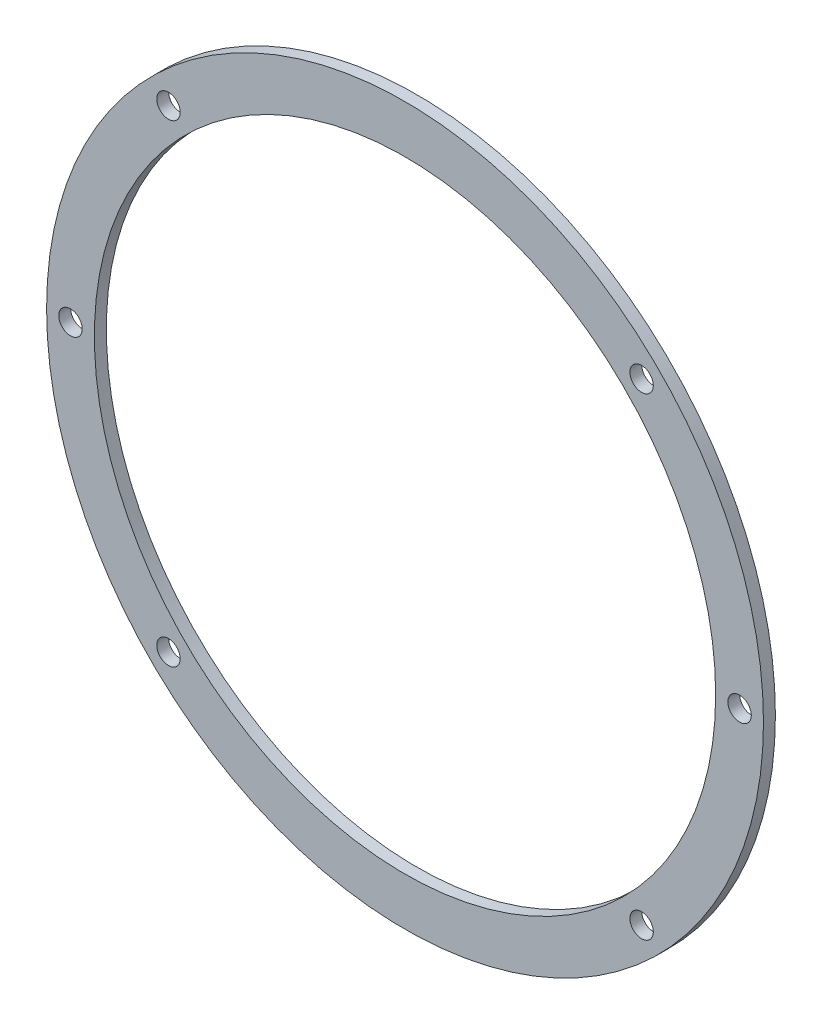
ISO-10303-21;
HEADER;
FILE_DESCRIPTION(('STEP AP214'),'2;1');
FILE_NAME('part.step','',(''),(''),'','','');
FILE_SCHEMA(('AUTOMOTIVE_DESIGN { 1 0 10303 214 1 1 1 1 }'));
ENDSEC;
DATA;
#1=APPLICATION_CONTEXT('core data for automotive mechanical design processes');
#2=APPLICATION_PROTOCOL_DEFINITION('international standard','automotive_design',2000,#1);
#3=PRODUCT_CONTEXT('',#1,'mechanical');
#4=PRODUCT('Part','Part','',(#3));
#5=PRODUCT_RELATED_PRODUCT_CATEGORY('part','',(#4));
#6=PRODUCT_DEFINITION_FORMATION('','',#4);
#7=PRODUCT_DEFINITION_CONTEXT('part definition',#1,'design');
#8=PRODUCT_DEFINITION('design','',#6,#7);
#9=PRODUCT_DEFINITION_SHAPE('','',#8);
#10=(LENGTH_UNIT() NAMED_UNIT(*) SI_UNIT(.MILLI.,.METRE.));
#11=(NAMED_UNIT(*) PLANE_ANGLE_UNIT() SI_UNIT($,.RADIAN.));
#12=(NAMED_UNIT(*) SI_UNIT($,.STERADIAN.) SOLID_ANGLE_UNIT());
#13=UNCERTAINTY_MEASURE_WITH_UNIT(LENGTH_MEASURE(1.E-05),#10,'distance_accuracy_value','');
#14=(GEOMETRIC_REPRESENTATION_CONTEXT(3) GLOBAL_UNCERTAINTY_ASSIGNED_CONTEXT((#13)) GLOBAL_UNIT_ASSIGNED_CONTEXT((#10,
#11,#12)) REPRESENTATION_CONTEXT('',''));
#15=CARTESIAN_POINT('',(0.,0.,0.));
#16=DIRECTION('',(0.,0.,1.));
#17=DIRECTION('',(1.,0.,0.));
#18=AXIS2_PLACEMENT_3D('',#15,#16,#17);
#19=CARTESIAN_POINT('',(0.,0.,2.54));
#20=DIRECTION('',(0.,0.,1.));
#21=DIRECTION('',(1.,0.,0.));
#22=AXIS2_PLACEMENT_3D('',#19,#20,#21);
#23=PLANE('',#22);
#24=CARTESIAN_POINT('',(-50.2894342779872,50.2894342779873,2.54));
#25=DIRECTION('',(0.,0.,1.));
#26=DIRECTION('',(1.,0.,0.));
#27=AXIS2_PLACEMENT_3D('',#24,#25,#26);
#28=CIRCLE('',#27,2.48919999999999);
#29=CARTESIAN_POINT('',(-47.8002342779872,50.2894342779873,2.54));
#30=VERTEX_POINT('',#29);
#31=EDGE_CURVE('E111',#30,#30,#28,.T.);
#32=ORIENTED_EDGE('',*,*,#31,.F.);
#33=EDGE_LOOP('',(#32));
#34=FACE_BOUND('',#33,.T.);
#35=CARTESIAN_POINT('',(-71.12,0.,2.54));
#36=DIRECTION('',(0.,0.,1.));
#37=DIRECTION('',(1.,0.,0.));
#38=AXIS2_PLACEMENT_3D('',#35,#36,#37);
#39=CIRCLE('',#38,2.4892);
#40=CARTESIAN_POINT('',(-68.6308,0.,2.54));
#41=VERTEX_POINT('',#40);
#42=EDGE_CURVE('E72',#41,#41,#39,.T.);
#43=ORIENTED_EDGE('',*,*,#42,.F.);
#44=EDGE_LOOP('',(#43));
#45=FACE_BOUND('',#44,.T.);
#46=CARTESIAN_POINT('',(-50.2894342779872,-50.2894342779873,2.54));
#47=DIRECTION('',(0.,0.,1.));
#48=DIRECTION('',(1.,0.,0.));
#49=AXIS2_PLACEMENT_3D('',#46,#47,#48);
#50=CIRCLE('',#49,2.48919999999999);
#51=CARTESIAN_POINT('',(-47.8002342779872,-50.2894342779873,2.54));
#52=VERTEX_POINT('',#51);
#53=EDGE_CURVE('E60',#52,#52,#50,.T.);
#54=ORIENTED_EDGE('',*,*,#53,.F.);
#55=EDGE_LOOP('',(#54));
#56=FACE_BOUND('',#55,.T.);
#57=CARTESIAN_POINT('',(50.2894342779872,-50.2894342779873,2.54));
#58=DIRECTION('',(0.,0.,1.));
#59=DIRECTION('',(1.,0.,0.));
#60=AXIS2_PLACEMENT_3D('',#57,#58,#59);
#61=CIRCLE('',#60,2.48919999999999);
#62=CARTESIAN_POINT('',(52.7786342779871,-50.2894342779873,2.54));
#63=VERTEX_POINT('',#62);
#64=EDGE_CURVE('E59',#63,#63,#61,.T.);
#65=ORIENTED_EDGE('',*,*,#64,.F.);
#66=EDGE_LOOP('',(#65));
#67=FACE_BOUND('',#66,.T.);
#68=CARTESIAN_POINT('',(71.12,0.,2.54));
#69=DIRECTION('',(0.,0.,1.));
#70=DIRECTION('',(1.,0.,0.));
#71=AXIS2_PLACEMENT_3D('',#68,#69,#70);
#72=CIRCLE('',#71,2.4892);
#73=CARTESIAN_POINT('',(73.6092,0.,2.54));
#74=VERTEX_POINT('',#73);
#75=EDGE_CURVE('E56',#74,#74,#72,.T.);
#76=ORIENTED_EDGE('',*,*,#75,.F.);
#77=EDGE_LOOP('',(#76));
#78=FACE_BOUND('',#77,.T.);
#79=CARTESIAN_POINT('',(50.2894342779872,50.2894342779873,2.54));
#80=DIRECTION('',(0.,0.,1.));
#81=DIRECTION('',(1.,0.,0.));
#82=AXIS2_PLACEMENT_3D('',#79,#80,#81);
#83=CIRCLE('',#82,2.48919999999999);
#84=CARTESIAN_POINT('',(52.7786342779871,50.2894342779873,2.54));
#85=VERTEX_POINT('',#84);
#86=EDGE_CURVE('E53',#85,#85,#83,.T.);
#87=ORIENTED_EDGE('',*,*,#86,.F.);
#88=EDGE_LOOP('',(#87));
#89=FACE_BOUND('',#88,.T.);
#90=CARTESIAN_POINT('',(0.,0.,2.54));
#91=DIRECTION('',(0.,0.,1.));
#92=DIRECTION('',(1.,0.,0.));
#93=AXIS2_PLACEMENT_3D('',#90,#91,#92);
#94=CIRCLE('',#93,76.2);
#95=CARTESIAN_POINT('',(76.2,0.,2.54));
#96=VERTEX_POINT('',#95);
#97=EDGE_CURVE('E10',#96,#96,#94,.T.);
#98=ORIENTED_EDGE('',*,*,#97,.T.);
#99=EDGE_LOOP('',(#98));
#100=FACE_BOUND('',#99,.T.);
#101=CARTESIAN_POINT('',(0.,0.,2.54));
#102=DIRECTION('',(0.,0.,1.));
#103=DIRECTION('',(1.,0.,0.));
#104=AXIS2_PLACEMENT_3D('',#101,#102,#103);
#105=CIRCLE('',#104,66.04);
#106=CARTESIAN_POINT('',(66.04,0.,2.54));
#107=VERTEX_POINT('',#106);
#108=EDGE_CURVE('E44',#107,#107,#105,.T.);
#109=ORIENTED_EDGE('',*,*,#108,.F.);
#110=EDGE_LOOP('',(#109));
#111=FACE_BOUND('',#110,.T.);
#112=ADVANCED_FACE('F31',(#34,#45,#56,#67,#78,#89,#100,#111),#23,.T.);
#113=CARTESIAN_POINT('',(0.,0.,0.));
#114=DIRECTION('',(0.,0.,1.));
#115=DIRECTION('',(1.,0.,0.));
#116=AXIS2_PLACEMENT_3D('',#113,#114,#115);
#117=PLANE('',#116);
#118=CARTESIAN_POINT('',(-50.2894342779872,50.2894342779873,0.));
#119=DIRECTION('',(0.,0.,1.));
#120=DIRECTION('',(1.,0.,0.));
#121=AXIS2_PLACEMENT_3D('',#118,#119,#120);
#122=CIRCLE('',#121,2.48919999999999);
#123=CARTESIAN_POINT('',(-47.8002342779872,50.2894342779873,0.));
#124=VERTEX_POINT('',#123);
#125=EDGE_CURVE('E35',#124,#124,#122,.T.);
#126=ORIENTED_EDGE('',*,*,#125,.T.);
#127=EDGE_LOOP('',(#126));
#128=FACE_BOUND('',#127,.T.);
#129=CARTESIAN_POINT('',(-71.12,0.,0.));
#130=DIRECTION('',(0.,0.,1.));
#131=DIRECTION('',(1.,0.,0.));
#132=AXIS2_PLACEMENT_3D('',#129,#130,#131);
#133=CIRCLE('',#132,2.48919999999999);
#134=CARTESIAN_POINT('',(-68.6308,0.,0.));
#135=VERTEX_POINT('',#134);
#136=EDGE_CURVE('E67',#135,#135,#133,.T.);
#137=ORIENTED_EDGE('',*,*,#136,.T.);
#138=EDGE_LOOP('',(#137));
#139=FACE_BOUND('',#138,.T.);
#140=CARTESIAN_POINT('',(-50.2894342779872,-50.2894342779873,0.));
#141=DIRECTION('',(0.,0.,1.));
#142=DIRECTION('',(1.,0.,0.));
#143=AXIS2_PLACEMENT_3D('',#140,#141,#142);
#144=CIRCLE('',#143,2.48919999999999);
#145=CARTESIAN_POINT('',(-47.8002342779872,-50.2894342779873,0.));
#146=VERTEX_POINT('',#145);
#147=EDGE_CURVE('E57',#146,#146,#144,.T.);
#148=ORIENTED_EDGE('',*,*,#147,.T.);
#149=EDGE_LOOP('',(#148));
#150=FACE_BOUND('',#149,.T.);
#151=CARTESIAN_POINT('',(50.2894342779872,-50.2894342779873,0.));
#152=DIRECTION('',(0.,0.,1.));
#153=DIRECTION('',(1.,0.,0.));
#154=AXIS2_PLACEMENT_3D('',#151,#152,#153);
#155=CIRCLE('',#154,2.48919999999999);
#156=CARTESIAN_POINT('',(52.7786342779871,-50.2894342779873,0.));
#157=VERTEX_POINT('',#156);
#158=EDGE_CURVE('E64',#157,#157,#155,.T.);
#159=ORIENTED_EDGE('',*,*,#158,.T.);
#160=EDGE_LOOP('',(#159));
#161=FACE_BOUND('',#160,.T.);
#162=CARTESIAN_POINT('',(71.12,0.,0.));
#163=DIRECTION('',(0.,0.,1.));
#164=DIRECTION('',(1.,0.,0.));
#165=AXIS2_PLACEMENT_3D('',#162,#163,#164);
#166=CIRCLE('',#165,2.48919999999999);
#167=CARTESIAN_POINT('',(73.6092,0.,0.));
#168=VERTEX_POINT('',#167);
#169=EDGE_CURVE('E54',#168,#168,#166,.T.);
#170=ORIENTED_EDGE('',*,*,#169,.T.);
#171=EDGE_LOOP('',(#170));
#172=FACE_BOUND('',#171,.T.);
#173=CARTESIAN_POINT('',(50.2894342779872,50.2894342779873,0.));
#174=DIRECTION('',(0.,0.,1.));
#175=DIRECTION('',(1.,0.,0.));
#176=AXIS2_PLACEMENT_3D('',#173,#174,#175);
#177=CIRCLE('',#176,2.48919999999999);
#178=CARTESIAN_POINT('',(52.7786342779871,50.2894342779873,0.));
#179=VERTEX_POINT('',#178);
#180=EDGE_CURVE('E50',#179,#179,#177,.T.);
#181=ORIENTED_EDGE('',*,*,#180,.T.);
#182=EDGE_LOOP('',(#181));
#183=FACE_BOUND('',#182,.T.);
#184=CARTESIAN_POINT('',(0.,0.,0.));
#185=DIRECTION('',(0.,0.,1.));
#186=DIRECTION('',(1.,0.,0.));
#187=AXIS2_PLACEMENT_3D('',#184,#185,#186);
#188=CIRCLE('',#187,76.2);
#189=CARTESIAN_POINT('',(76.2,0.,0.));
#190=VERTEX_POINT('',#189);
#191=EDGE_CURVE('E39',#190,#190,#188,.T.);
#192=ORIENTED_EDGE('',*,*,#191,.F.);
#193=EDGE_LOOP('',(#192));
#194=FACE_BOUND('',#193,.T.);
#195=CARTESIAN_POINT('',(0.,0.,0.));
#196=DIRECTION('',(0.,0.,1.));
#197=DIRECTION('',(1.,0.,0.));
#198=AXIS2_PLACEMENT_3D('',#195,#196,#197);
#199=CIRCLE('',#198,66.04);
#200=CARTESIAN_POINT('',(66.04,0.,0.));
#201=VERTEX_POINT('',#200);
#202=EDGE_CURVE('E47',#201,#201,#199,.T.);
#203=ORIENTED_EDGE('',*,*,#202,.T.);
#204=EDGE_LOOP('',(#203));
#205=FACE_BOUND('',#204,.T.);
#206=ADVANCED_FACE('F87',(#128,#139,#150,#161,#172,#183,#194,#205),#117,.F.);
#207=CARTESIAN_POINT('',(0.,0.,2.54));
#208=DIRECTION('',(0.,0.,-1.));
#209=DIRECTION('',(-1.,0.,0.));
#210=AXIS2_PLACEMENT_3D('',#207,#208,#209);
#211=CYLINDRICAL_SURFACE('',#210,76.2);
#212=ORIENTED_EDGE('',*,*,#97,.F.);
#213=EDGE_LOOP('',(#212));
#214=FACE_BOUND('',#213,.T.);
#215=ORIENTED_EDGE('',*,*,#191,.T.);
#216=EDGE_LOOP('',(#215));
#217=FACE_BOUND('',#216,.T.);
#218=ADVANCED_FACE('F33',(#214,#217),#211,.T.);
#219=CARTESIAN_POINT('',(0.,0.,2.54));
#220=DIRECTION('',(0.,0.,-1.));
#221=DIRECTION('',(-1.,0.,0.));
#222=AXIS2_PLACEMENT_3D('',#219,#220,#221);
#223=CYLINDRICAL_SURFACE('',#222,66.04);
#224=ORIENTED_EDGE('',*,*,#108,.T.);
#225=EDGE_LOOP('',(#224));
#226=FACE_BOUND('',#225,.T.);
#227=ORIENTED_EDGE('',*,*,#202,.F.);
#228=EDGE_LOOP('',(#227));
#229=FACE_BOUND('',#228,.T.);
#230=ADVANCED_FACE('F89',(#226,#229),#223,.F.);
#231=CARTESIAN_POINT('',(50.2894342779872,50.2894342779873,2.54));
#232=DIRECTION('',(0.,0.,1.));
#233=DIRECTION('',(1.,0.,0.));
#234=AXIS2_PLACEMENT_3D('',#231,#232,#233);
#235=CYLINDRICAL_SURFACE('',#234,2.48919999999999);
#236=ORIENTED_EDGE('',*,*,#86,.T.);
#237=EDGE_LOOP('',(#236));
#238=FACE_BOUND('',#237,.T.);
#239=ORIENTED_EDGE('',*,*,#180,.F.);
#240=EDGE_LOOP('',(#239));
#241=FACE_BOUND('',#240,.T.);
#242=ADVANCED_FACE('F91',(#238,#241),#235,.F.);
#243=CARTESIAN_POINT('',(71.12,0.,2.54));
#244=DIRECTION('',(0.,0.,1.));
#245=DIRECTION('',(1.,0.,0.));
#246=AXIS2_PLACEMENT_3D('',#243,#244,#245);
#247=CYLINDRICAL_SURFACE('',#246,2.48919999999999);
#248=ORIENTED_EDGE('',*,*,#75,.T.);
#249=EDGE_LOOP('',(#248));
#250=FACE_BOUND('',#249,.T.);
#251=ORIENTED_EDGE('',*,*,#169,.F.);
#252=EDGE_LOOP('',(#251));
#253=FACE_BOUND('',#252,.T.);
#254=ADVANCED_FACE('F97',(#250,#253),#247,.F.);
#255=CARTESIAN_POINT('',(50.2894342779872,-50.2894342779873,2.54));
#256=DIRECTION('',(0.,0.,1.));
#257=DIRECTION('',(1.,0.,0.));
#258=AXIS2_PLACEMENT_3D('',#255,#256,#257);
#259=CYLINDRICAL_SURFACE('',#258,2.48919999999999);
#260=ORIENTED_EDGE('',*,*,#64,.T.);
#261=EDGE_LOOP('',(#260));
#262=FACE_BOUND('',#261,.T.);
#263=ORIENTED_EDGE('',*,*,#158,.F.);
#264=EDGE_LOOP('',(#263));
#265=FACE_BOUND('',#264,.T.);
#266=ADVANCED_FACE('F131',(#262,#265),#259,.F.);
#267=CARTESIAN_POINT('',(-50.2894342779872,-50.2894342779873,2.54));
#268=DIRECTION('',(0.,0.,1.));
#269=DIRECTION('',(1.,0.,0.));
#270=AXIS2_PLACEMENT_3D('',#267,#268,#269);
#271=CYLINDRICAL_SURFACE('',#270,2.48919999999999);
#272=ORIENTED_EDGE('',*,*,#53,.T.);
#273=EDGE_LOOP('',(#272));
#274=FACE_BOUND('',#273,.T.);
#275=ORIENTED_EDGE('',*,*,#147,.F.);
#276=EDGE_LOOP('',(#275));
#277=FACE_BOUND('',#276,.T.);
#278=ADVANCED_FACE('F138',(#274,#277),#271,.F.);
#279=CARTESIAN_POINT('',(-71.12,0.,2.54));
#280=DIRECTION('',(0.,0.,1.));
#281=DIRECTION('',(1.,0.,0.));
#282=AXIS2_PLACEMENT_3D('',#279,#280,#281);
#283=CYLINDRICAL_SURFACE('',#282,2.48919999999999);
#284=ORIENTED_EDGE('',*,*,#42,.T.);
#285=EDGE_LOOP('',(#284));
#286=FACE_BOUND('',#285,.T.);
#287=ORIENTED_EDGE('',*,*,#136,.F.);
#288=EDGE_LOOP('',(#287));
#289=FACE_BOUND('',#288,.T.);
#290=ADVANCED_FACE('F144',(#286,#289),#283,.F.);
#291=CARTESIAN_POINT('',(-50.2894342779872,50.2894342779873,2.54));
#292=DIRECTION('',(0.,0.,1.));
#293=DIRECTION('',(1.,0.,0.));
#294=AXIS2_PLACEMENT_3D('',#291,#292,#293);
#295=CYLINDRICAL_SURFACE('',#294,2.48919999999999);
#296=ORIENTED_EDGE('',*,*,#31,.T.);
#297=EDGE_LOOP('',(#296));
#298=FACE_BOUND('',#297,.T.);
#299=ORIENTED_EDGE('',*,*,#125,.F.);
#300=EDGE_LOOP('',(#299));
#301=FACE_BOUND('',#300,.T.);
#302=ADVANCED_FACE('F147',(#298,#301),#295,.F.);
#303=CLOSED_SHELL('',(#112,#206,#218,#230,#242,#254,#266,#278,#290,#302));
#304=MANIFOLD_SOLID_BREP('B2',#303);
#305=ADVANCED_BREP_SHAPE_REPRESENTATION('',(#18,#304),#14);
#306=SHAPE_DEFINITION_REPRESENTATION(#9,#305);
ENDSEC;
END-ISO-10303-21;
